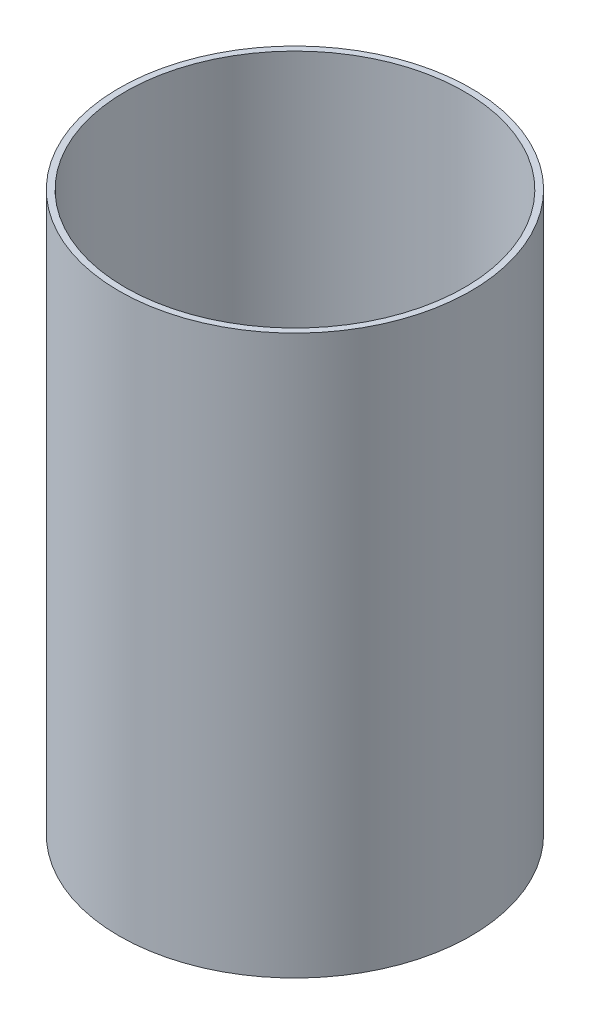
ISO-10303-21;
HEADER;
FILE_DESCRIPTION(('STEP AP214'),'2;1');
FILE_NAME('part.step','',(''),(''),'','','');
FILE_SCHEMA(('AUTOMOTIVE_DESIGN { 1 0 10303 214 1 1 1 1 }'));
ENDSEC;
DATA;
#1=APPLICATION_CONTEXT('core data for automotive mechanical design processes');
#2=APPLICATION_PROTOCOL_DEFINITION('international standard','automotive_design',2000,#1);
#3=PRODUCT_CONTEXT('',#1,'mechanical');
#4=PRODUCT('Part','Part','',(#3));
#5=PRODUCT_RELATED_PRODUCT_CATEGORY('part','',(#4));
#6=PRODUCT_DEFINITION_FORMATION('','',#4);
#7=PRODUCT_DEFINITION_CONTEXT('part definition',#1,'design');
#8=PRODUCT_DEFINITION('design','',#6,#7);
#9=PRODUCT_DEFINITION_SHAPE('','',#8);
#10=(LENGTH_UNIT() NAMED_UNIT(*) SI_UNIT(.MILLI.,.METRE.));
#11=(NAMED_UNIT(*) PLANE_ANGLE_UNIT() SI_UNIT($,.RADIAN.));
#12=(NAMED_UNIT(*) SI_UNIT($,.STERADIAN.) SOLID_ANGLE_UNIT());
#13=UNCERTAINTY_MEASURE_WITH_UNIT(LENGTH_MEASURE(1.E-05),#10,'distance_accuracy_value','');
#14=(GEOMETRIC_REPRESENTATION_CONTEXT(3) GLOBAL_UNCERTAINTY_ASSIGNED_CONTEXT((#13)) GLOBAL_UNIT_ASSIGNED_CONTEXT((#10,
#11,#12)) REPRESENTATION_CONTEXT('',''));
#15=CARTESIAN_POINT('',(0.,0.,0.));
#16=DIRECTION('',(0.,0.,1.));
#17=DIRECTION('',(1.,0.,0.));
#18=AXIS2_PLACEMENT_3D('',#15,#16,#17);
#19=CARTESIAN_POINT('',(0.,270.,0.));
#20=DIRECTION('',(0.,1.,0.));
#21=DIRECTION('',(0.,0.,1.));
#22=AXIS2_PLACEMENT_3D('',#19,#20,#21);
#23=PLANE('',#22);
#24=CARTESIAN_POINT('',(0.,270.,0.));
#25=DIRECTION('',(0.,1.,0.));
#26=DIRECTION('',(0.,0.,1.));
#27=AXIS2_PLACEMENT_3D('',#24,#25,#26);
#28=CIRCLE('',#27,85.);
#29=CARTESIAN_POINT('',(0.,270.,85.));
#30=VERTEX_POINT('',#29);
#31=EDGE_CURVE('E10',#30,#30,#28,.T.);
#32=ORIENTED_EDGE('',*,*,#31,.T.);
#33=EDGE_LOOP('',(#32));
#34=FACE_BOUND('',#33,.T.);
#35=CARTESIAN_POINT('',(0.,270.,0.));
#36=DIRECTION('',(0.,1.,0.));
#37=DIRECTION('',(0.,0.,1.));
#38=AXIS2_PLACEMENT_3D('',#35,#36,#37);
#39=CIRCLE('',#38,82.);
#40=CARTESIAN_POINT('',(0.,270.,82.));
#41=VERTEX_POINT('',#40);
#42=EDGE_CURVE('E56',#41,#41,#39,.T.);
#43=ORIENTED_EDGE('',*,*,#42,.F.);
#44=EDGE_LOOP('',(#43));
#45=FACE_BOUND('',#44,.T.);
#46=ADVANCED_FACE('F43',(#34,#45),#23,.T.);
#47=CARTESIAN_POINT('',(0.,0.,0.));
#48=DIRECTION('',(0.,1.,0.));
#49=DIRECTION('',(0.,0.,1.));
#50=AXIS2_PLACEMENT_3D('',#47,#48,#49);
#51=PLANE('',#50);
#52=CARTESIAN_POINT('',(0.,0.,0.));
#53=DIRECTION('',(0.,1.,0.));
#54=DIRECTION('',(0.,0.,1.));
#55=AXIS2_PLACEMENT_3D('',#52,#53,#54);
#56=CIRCLE('',#55,85.);
#57=CARTESIAN_POINT('',(0.,0.,85.));
#58=VERTEX_POINT('',#57);
#59=EDGE_CURVE('E47',#58,#58,#56,.T.);
#60=ORIENTED_EDGE('',*,*,#59,.F.);
#61=EDGE_LOOP('',(#60));
#62=FACE_BOUND('',#61,.T.);
#63=CARTESIAN_POINT('',(0.,0.,0.));
#64=DIRECTION('',(0.,1.,0.));
#65=DIRECTION('',(0.,0.,1.));
#66=AXIS2_PLACEMENT_3D('',#63,#64,#65);
#67=CIRCLE('',#66,82.);
#68=CARTESIAN_POINT('',(0.,0.,82.));
#69=VERTEX_POINT('',#68);
#70=EDGE_CURVE('E58',#69,#69,#67,.T.);
#71=ORIENTED_EDGE('',*,*,#70,.T.);
#72=EDGE_LOOP('',(#71));
#73=FACE_BOUND('',#72,.T.);
#74=ADVANCED_FACE('F70',(#62,#73),#51,.F.);
#75=CARTESIAN_POINT('',(0.,270.,0.));
#76=DIRECTION('',(0.,-1.,0.));
#77=DIRECTION('',(0.,0.,-1.));
#78=AXIS2_PLACEMENT_3D('',#75,#76,#77);
#79=CYLINDRICAL_SURFACE('',#78,85.);
#80=ORIENTED_EDGE('',*,*,#31,.F.);
#81=EDGE_LOOP('',(#80));
#82=FACE_BOUND('',#81,.T.);
#83=ORIENTED_EDGE('',*,*,#59,.T.);
#84=EDGE_LOOP('',(#83));
#85=FACE_BOUND('',#84,.T.);
#86=ADVANCED_FACE('F45',(#82,#85),#79,.T.);
#87=CARTESIAN_POINT('',(0.,270.,0.));
#88=DIRECTION('',(0.,-1.,0.));
#89=DIRECTION('',(0.,0.,-1.));
#90=AXIS2_PLACEMENT_3D('',#87,#88,#89);
#91=CYLINDRICAL_SURFACE('',#90,82.);
#92=ORIENTED_EDGE('',*,*,#42,.T.);
#93=EDGE_LOOP('',(#92));
#94=FACE_BOUND('',#93,.T.);
#95=ORIENTED_EDGE('',*,*,#70,.F.);
#96=EDGE_LOOP('',(#95));
#97=FACE_BOUND('',#96,.T.);
#98=ADVANCED_FACE('F66',(#94,#97),#91,.F.);
#99=CLOSED_SHELL('',(#46,#74,#86,#98));
#100=MANIFOLD_SOLID_BREP('B2',#99);
#101=ADVANCED_BREP_SHAPE_REPRESENTATION('',(#18,#100),#14);
#102=SHAPE_DEFINITION_REPRESENTATION(#9,#101);
ENDSEC;
END-ISO-10303-21;
